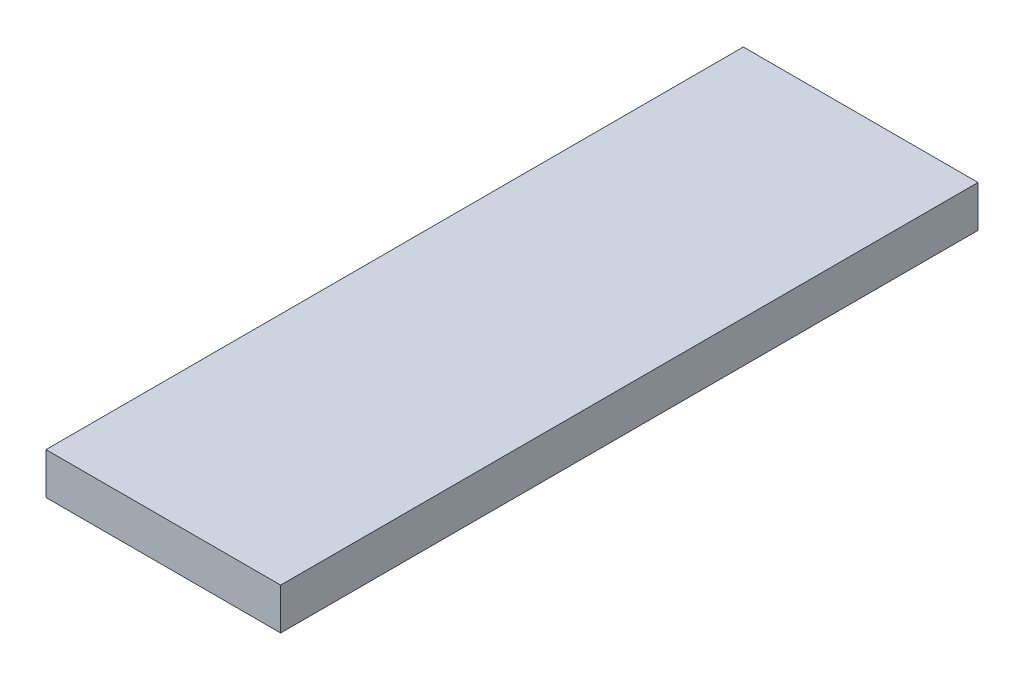
ISO-10303-21;
HEADER;
FILE_DESCRIPTION(('STEP AP214'),'2;1');
FILE_NAME('part.step','',(''),(''),'','','');
FILE_SCHEMA(('AUTOMOTIVE_DESIGN { 1 0 10303 214 1 1 1 1 }'));
ENDSEC;
DATA;
#1=APPLICATION_CONTEXT('core data for automotive mechanical design processes');
#2=APPLICATION_PROTOCOL_DEFINITION('international standard','automotive_design',2000,#1);
#3=PRODUCT_CONTEXT('',#1,'mechanical');
#4=PRODUCT('Part','Part','',(#3));
#5=PRODUCT_RELATED_PRODUCT_CATEGORY('part','',(#4));
#6=PRODUCT_DEFINITION_FORMATION('','',#4);
#7=PRODUCT_DEFINITION_CONTEXT('part definition',#1,'design');
#8=PRODUCT_DEFINITION('design','',#6,#7);
#9=PRODUCT_DEFINITION_SHAPE('','',#8);
#10=(LENGTH_UNIT() NAMED_UNIT(*) SI_UNIT(.MILLI.,.METRE.));
#11=(NAMED_UNIT(*) PLANE_ANGLE_UNIT() SI_UNIT($,.RADIAN.));
#12=(NAMED_UNIT(*) SI_UNIT($,.STERADIAN.) SOLID_ANGLE_UNIT());
#13=UNCERTAINTY_MEASURE_WITH_UNIT(LENGTH_MEASURE(1.E-05),#10,'distance_accuracy_value','');
#14=(GEOMETRIC_REPRESENTATION_CONTEXT(3) GLOBAL_UNCERTAINTY_ASSIGNED_CONTEXT((#13)) GLOBAL_UNIT_ASSIGNED_CONTEXT((#10,
#11,#12)) REPRESENTATION_CONTEXT('',''));
#15=CARTESIAN_POINT('',(0.,0.,0.));
#16=DIRECTION('',(0.,0.,1.));
#17=DIRECTION('',(1.,0.,0.));
#18=AXIS2_PLACEMENT_3D('',#15,#16,#17);
#19=CARTESIAN_POINT('',(0.,9.525,0.));
#20=DIRECTION('',(1.,0.,0.));
#21=DIRECTION('',(0.,0.,-1.));
#22=AXIS2_PLACEMENT_3D('',#19,#20,#21);
#23=PLANE('',#22);
#24=DIRECTION('',(0.,0.,1.));
#25=VECTOR('',#24,1.);
#26=CARTESIAN_POINT('',(0.,0.,0.));
#27=LINE('',#26,#25);
#28=CARTESIAN_POINT('',(0.,0.,-160.02));
#29=VERTEX_POINT('',#28);
#30=CARTESIAN_POINT('',(0.,0.,0.));
#31=VERTEX_POINT('',#30);
#32=EDGE_CURVE('E100',#29,#31,#27,.T.);
#33=ORIENTED_EDGE('',*,*,#32,.T.);
#34=DIRECTION('',(0.,-1.,0.));
#35=VECTOR('',#34,1.);
#36=CARTESIAN_POINT('',(0.,9.525,0.));
#37=LINE('',#36,#35);
#38=CARTESIAN_POINT('',(0.,9.525,0.));
#39=VERTEX_POINT('',#38);
#40=EDGE_CURVE('E11',#39,#31,#37,.T.);
#41=ORIENTED_EDGE('',*,*,#40,.F.);
#42=DIRECTION('',(0.,0.,1.));
#43=VECTOR('',#42,1.);
#44=CARTESIAN_POINT('',(0.,9.525,0.));
#45=LINE('',#44,#43);
#46=CARTESIAN_POINT('',(0.,9.525,-160.02));
#47=VERTEX_POINT('',#46);
#48=EDGE_CURVE('E88',#47,#39,#45,.T.);
#49=ORIENTED_EDGE('',*,*,#48,.F.);
#50=DIRECTION('',(0.,-1.,0.));
#51=VECTOR('',#50,1.);
#52=CARTESIAN_POINT('',(0.,9.525,-160.02));
#53=LINE('',#52,#51);
#54=EDGE_CURVE('E96',#47,#29,#53,.T.);
#55=ORIENTED_EDGE('',*,*,#54,.T.);
#56=EDGE_LOOP('',(#33,#41,#49,#55));
#57=FACE_BOUND('',#56,.T.);
#58=ADVANCED_FACE('F37',(#57),#23,.F.);
#59=CARTESIAN_POINT('',(0.,9.525,0.));
#60=DIRECTION('',(0.,0.,-1.));
#61=DIRECTION('',(-1.,0.,0.));
#62=AXIS2_PLACEMENT_3D('',#59,#60,#61);
#63=PLANE('',#62);
#64=DIRECTION('',(1.,0.,0.));
#65=VECTOR('',#64,1.);
#66=CARTESIAN_POINT('',(0.,0.,0.));
#67=LINE('',#66,#65);
#68=CARTESIAN_POINT('',(53.848,0.,0.));
#69=VERTEX_POINT('',#68);
#70=EDGE_CURVE('E92',#31,#69,#67,.T.);
#71=ORIENTED_EDGE('',*,*,#70,.T.);
#72=DIRECTION('',(0.,-1.,0.));
#73=VECTOR('',#72,1.);
#74=CARTESIAN_POINT('',(53.848,9.525,0.));
#75=LINE('',#74,#73);
#76=CARTESIAN_POINT('',(53.848,9.525,0.));
#77=VERTEX_POINT('',#76);
#78=EDGE_CURVE('E45',#77,#69,#75,.T.);
#79=ORIENTED_EDGE('',*,*,#78,.F.);
#80=DIRECTION('',(1.,0.,0.));
#81=VECTOR('',#80,1.);
#82=CARTESIAN_POINT('',(0.,9.525,0.));
#83=LINE('',#82,#81);
#84=EDGE_CURVE('E83',#39,#77,#83,.T.);
#85=ORIENTED_EDGE('',*,*,#84,.F.);
#86=ORIENTED_EDGE('',*,*,#40,.T.);
#87=EDGE_LOOP('',(#71,#79,#85,#86));
#88=FACE_BOUND('',#87,.T.);
#89=ADVANCED_FACE('F91',(#88),#63,.F.);
#90=CARTESIAN_POINT('',(53.848,9.525,0.));
#91=DIRECTION('',(-1.,0.,0.));
#92=DIRECTION('',(0.,0.,1.));
#93=AXIS2_PLACEMENT_3D('',#90,#91,#92);
#94=PLANE('',#93);
#95=DIRECTION('',(0.,0.,-1.));
#96=VECTOR('',#95,1.);
#97=CARTESIAN_POINT('',(53.848,0.,0.));
#98=LINE('',#97,#96);
#99=CARTESIAN_POINT('',(53.848,0.,-160.02));
#100=VERTEX_POINT('',#99);
#101=EDGE_CURVE('E70',#69,#100,#98,.T.);
#102=ORIENTED_EDGE('',*,*,#101,.T.);
#103=DIRECTION('',(0.,-1.,0.));
#104=VECTOR('',#103,1.);
#105=CARTESIAN_POINT('',(53.848,9.525,-160.02));
#106=LINE('',#105,#104);
#107=CARTESIAN_POINT('',(53.848,9.525,-160.02));
#108=VERTEX_POINT('',#107);
#109=EDGE_CURVE('E93',#108,#100,#106,.T.);
#110=ORIENTED_EDGE('',*,*,#109,.F.);
#111=DIRECTION('',(0.,0.,-1.));
#112=VECTOR('',#111,1.);
#113=CARTESIAN_POINT('',(53.848,9.525,0.));
#114=LINE('',#113,#112);
#115=EDGE_CURVE('E86',#77,#108,#114,.T.);
#116=ORIENTED_EDGE('',*,*,#115,.F.);
#117=ORIENTED_EDGE('',*,*,#78,.T.);
#118=EDGE_LOOP('',(#102,#110,#116,#117));
#119=FACE_BOUND('',#118,.T.);
#120=ADVANCED_FACE('F94',(#119),#94,.F.);
#121=CARTESIAN_POINT('',(0.,9.525,-160.02));
#122=DIRECTION('',(0.,0.,1.));
#123=DIRECTION('',(1.,0.,0.));
#124=AXIS2_PLACEMENT_3D('',#121,#122,#123);
#125=PLANE('',#124);
#126=DIRECTION('',(-1.,0.,0.));
#127=VECTOR('',#126,1.);
#128=CARTESIAN_POINT('',(0.,0.,-160.02));
#129=LINE('',#128,#127);
#130=EDGE_CURVE('E76',#100,#29,#129,.T.);
#131=ORIENTED_EDGE('',*,*,#130,.T.);
#132=ORIENTED_EDGE('',*,*,#54,.F.);
#133=DIRECTION('',(-1.,0.,0.));
#134=VECTOR('',#133,1.);
#135=CARTESIAN_POINT('',(0.,9.525,-160.02));
#136=LINE('',#135,#134);
#137=EDGE_CURVE('E53',#108,#47,#136,.T.);
#138=ORIENTED_EDGE('',*,*,#137,.F.);
#139=ORIENTED_EDGE('',*,*,#109,.T.);
#140=EDGE_LOOP('',(#131,#132,#138,#139));
#141=FACE_BOUND('',#140,.T.);
#142=ADVANCED_FACE('F107',(#141),#125,.F.);
#143=CARTESIAN_POINT('',(0.,9.525,0.));
#144=DIRECTION('',(0.,-1.,0.));
#145=DIRECTION('',(0.,0.,-1.));
#146=AXIS2_PLACEMENT_3D('',#143,#144,#145);
#147=PLANE('',#146);
#148=ORIENTED_EDGE('',*,*,#48,.T.);
#149=ORIENTED_EDGE('',*,*,#84,.T.);
#150=ORIENTED_EDGE('',*,*,#115,.T.);
#151=ORIENTED_EDGE('',*,*,#137,.T.);
#152=EDGE_LOOP('',(#148,#149,#150,#151));
#153=FACE_BOUND('',#152,.T.);
#154=ADVANCED_FACE('F84',(#153),#147,.F.);
#155=CARTESIAN_POINT('',(0.,0.,0.));
#156=DIRECTION('',(0.,-1.,0.));
#157=DIRECTION('',(0.,0.,-1.));
#158=AXIS2_PLACEMENT_3D('',#155,#156,#157);
#159=PLANE('',#158);
#160=ORIENTED_EDGE('',*,*,#32,.F.);
#161=ORIENTED_EDGE('',*,*,#130,.F.);
#162=ORIENTED_EDGE('',*,*,#101,.F.);
#163=ORIENTED_EDGE('',*,*,#70,.F.);
#164=EDGE_LOOP('',(#160,#161,#162,#163));
#165=FACE_BOUND('',#164,.T.);
#166=ADVANCED_FACE('F110',(#165),#159,.T.);
#167=CLOSED_SHELL('',(#58,#89,#120,#142,#154,#166));
#168=MANIFOLD_SOLID_BREP('B2',#167);
#169=ADVANCED_BREP_SHAPE_REPRESENTATION('',(#18,#168),#14);
#170=SHAPE_DEFINITION_REPRESENTATION(#9,#169);
ENDSEC;
END-ISO-10303-21;
